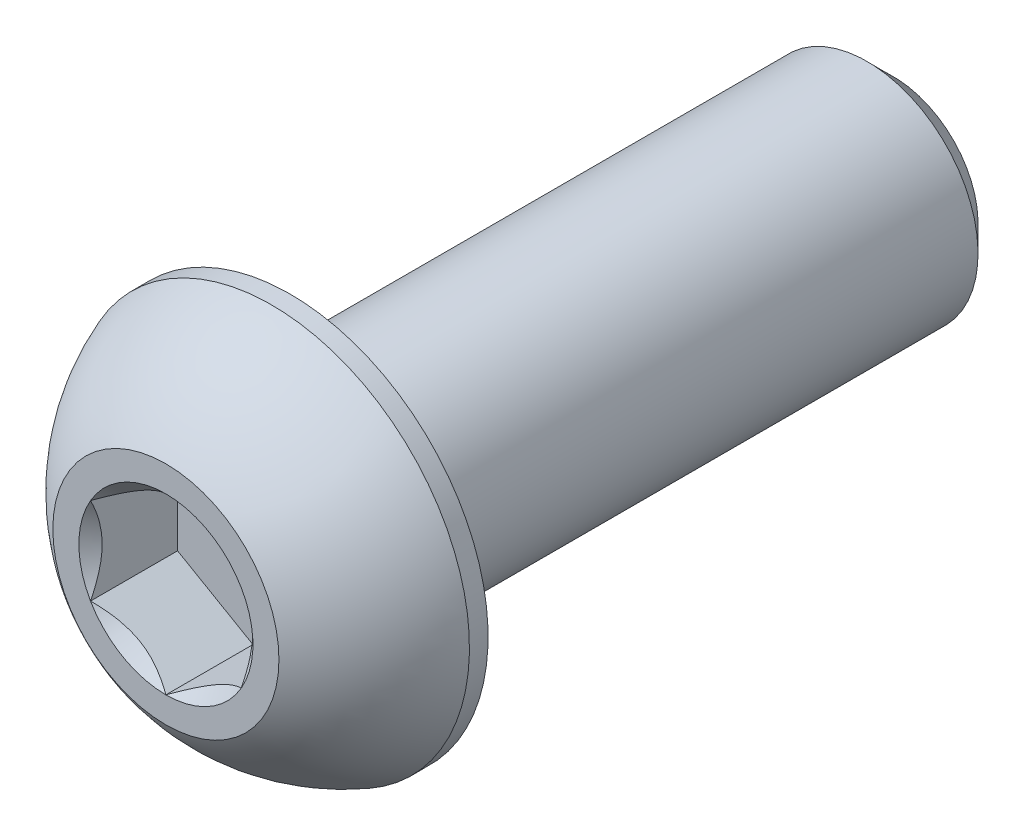
ISO-10303-21;
HEADER;
FILE_DESCRIPTION(('STEP AP214'),'2;1');
FILE_NAME('part.step','',(''),(''),'','','');
FILE_SCHEMA(('AUTOMOTIVE_DESIGN { 1 0 10303 214 1 1 1 1 }'));
ENDSEC;
DATA;
#1=APPLICATION_CONTEXT('core data for automotive mechanical design processes');
#2=APPLICATION_PROTOCOL_DEFINITION('international standard','automotive_design',2000,#1);
#3=PRODUCT_CONTEXT('',#1,'mechanical');
#4=PRODUCT('Part','Part','',(#3));
#5=PRODUCT_RELATED_PRODUCT_CATEGORY('part','',(#4));
#6=PRODUCT_DEFINITION_FORMATION('','',#4);
#7=PRODUCT_DEFINITION_CONTEXT('part definition',#1,'design');
#8=PRODUCT_DEFINITION('design','',#6,#7);
#9=PRODUCT_DEFINITION_SHAPE('','',#8);
#10=(LENGTH_UNIT() NAMED_UNIT(*) SI_UNIT(.MILLI.,.METRE.));
#11=(NAMED_UNIT(*) PLANE_ANGLE_UNIT() SI_UNIT($,.RADIAN.));
#12=(NAMED_UNIT(*) SI_UNIT($,.STERADIAN.) SOLID_ANGLE_UNIT());
#13=UNCERTAINTY_MEASURE_WITH_UNIT(LENGTH_MEASURE(1.E-05),#10,'distance_accuracy_value','');
#14=(GEOMETRIC_REPRESENTATION_CONTEXT(3) GLOBAL_UNCERTAINTY_ASSIGNED_CONTEXT((#13)) GLOBAL_UNIT_ASSIGNED_CONTEXT((#10,
#11,#12)) REPRESENTATION_CONTEXT('',''));
#15=CARTESIAN_POINT('',(0.,0.,0.));
#16=DIRECTION('',(0.,0.,1.));
#17=DIRECTION('',(1.,0.,0.));
#18=AXIS2_PLACEMENT_3D('',#15,#16,#17);
#19=CARTESIAN_POINT('',(0.,-2.3094010767585,0.99));
#20=DIRECTION('',(0.5,-0.866025403784439,0.));
#21=DIRECTION('',(0.,0.,-1.));
#22=AXIS2_PLACEMENT_3D('',#19,#20,#21);
#23=PLANE('',#22);
#24=DIRECTION('',(0.,0.,1.));
#25=VECTOR('',#24,1.);
#26=CARTESIAN_POINT('',(0.,-2.3094010767585,0.99));
#27=LINE('',#26,#25);
#28=CARTESIAN_POINT('',(0.,-2.3094010767585,0.99));
#29=VERTEX_POINT('',#28);
#30=CARTESIAN_POINT('',(0.,-2.3094010767585,3.3));
#31=VERTEX_POINT('',#30);
#32=EDGE_CURVE('E11',#29,#31,#27,.T.);
#33=ORIENTED_EDGE('',*,*,#32,.T.);
#34=CARTESIAN_POINT('',(-5.24396545160089E-12,-2.30940107676153,3.30000000000303));
#35=CARTESIAN_POINT('',(1.,-1.73205080756888,2.72264973080811));
#36=CARTESIAN_POINT('',(2.00000000000524,-1.15470053837622,3.30000000000303));
#37=(BOUNDED_CURVE() B_SPLINE_CURVE(2,(#34,#35,#36),.UNSPECIFIED.,.F.,
.F.) B_SPLINE_CURVE_WITH_KNOTS((3,3),(-0.45323387245921,-0.135550185295981),
.UNSPECIFIED.) CURVE() GEOMETRIC_REPRESENTATION_ITEM() RATIONAL_B_SPLINE_CURVE((1.23205080756801,
1.42264973081124,1.23205080756801)) REPRESENTATION_ITEM(''));
#38=CARTESIAN_POINT('',(2.,-1.15470053837925,3.3));
#39=VERTEX_POINT('',#38);
#40=EDGE_CURVE('E152',#31,#39,#37,.T.);
#41=ORIENTED_EDGE('',*,*,#40,.T.);
#42=DIRECTION('',(0.,0.,1.));
#43=VECTOR('',#42,1.);
#44=CARTESIAN_POINT('',(2.,-1.15470053837925,0.99));
#45=LINE('',#44,#43);
#46=CARTESIAN_POINT('',(2.,-1.15470053837925,0.99));
#47=VERTEX_POINT('',#46);
#48=EDGE_CURVE('E96',#47,#39,#45,.T.);
#49=ORIENTED_EDGE('',*,*,#48,.F.);
#50=DIRECTION('',(0.866025403784439,0.5,0.));
#51=VECTOR('',#50,1.);
#52=CARTESIAN_POINT('',(0.,-2.3094010767585,0.99));
#53=LINE('',#52,#51);
#54=EDGE_CURVE('E147',#29,#47,#53,.T.);
#55=ORIENTED_EDGE('',*,*,#54,.F.);
#56=EDGE_LOOP('',(#33,#41,#49,#55));
#57=FACE_BOUND('',#56,.T.);
#58=ADVANCED_FACE('F17',(#57),#23,.F.);
#59=CARTESIAN_POINT('',(-2.,-1.15470053837925,0.99));
#60=DIRECTION('',(-0.5,-0.866025403784439,0.));
#61=DIRECTION('',(-0.866025403784439,0.5,0.));
#62=AXIS2_PLACEMENT_3D('',#59,#60,#61);
#63=PLANE('',#62);
#64=DIRECTION('',(0.,0.,1.));
#65=VECTOR('',#64,1.);
#66=CARTESIAN_POINT('',(-2.,-1.15470053837925,0.99));
#67=LINE('',#66,#65);
#68=CARTESIAN_POINT('',(-2.,-1.15470053837925,0.99));
#69=VERTEX_POINT('',#68);
#70=CARTESIAN_POINT('',(-2.,-1.15470053837925,3.3));
#71=VERTEX_POINT('',#70);
#72=EDGE_CURVE('E28',#69,#71,#67,.T.);
#73=ORIENTED_EDGE('',*,*,#72,.T.);
#74=CARTESIAN_POINT('',(-2.00000000000525,-1.15470053837622,3.30000000000303));
#75=CARTESIAN_POINT('',(-1.,-1.73205080756888,2.72264973080811));
#76=CARTESIAN_POINT('',(5.24477645770228E-12,-2.30940107676153,3.30000000000303));
#77=(BOUNDED_CURVE() B_SPLINE_CURVE(2,(#74,#75,#76),.UNSPECIFIED.,.F.,
.F.) B_SPLINE_CURVE_WITH_KNOTS((3,3),(-0.45323387245921,-0.135550185295981),
.UNSPECIFIED.) CURVE() GEOMETRIC_REPRESENTATION_ITEM() RATIONAL_B_SPLINE_CURVE((1.23205080756801,
1.42264973081124,1.23205080756801)) REPRESENTATION_ITEM(''));
#78=EDGE_CURVE('E153',#71,#31,#77,.T.);
#79=ORIENTED_EDGE('',*,*,#78,.T.);
#80=ORIENTED_EDGE('',*,*,#32,.F.);
#81=DIRECTION('',(0.866025403784439,-0.5,0.));
#82=VECTOR('',#81,1.);
#83=CARTESIAN_POINT('',(-2.,-1.15470053837925,0.99));
#84=LINE('',#83,#82);
#85=EDGE_CURVE('E201',#69,#29,#84,.T.);
#86=ORIENTED_EDGE('',*,*,#85,.F.);
#87=EDGE_LOOP('',(#73,#79,#80,#86));
#88=FACE_BOUND('',#87,.T.);
#89=ADVANCED_FACE('F287',(#88),#63,.F.);
#90=CARTESIAN_POINT('',(-2.,1.15470053837925,0.99));
#91=DIRECTION('',(-1.,0.,0.));
#92=DIRECTION('',(0.,1.,0.));
#93=AXIS2_PLACEMENT_3D('',#90,#91,#92);
#94=PLANE('',#93);
#95=DIRECTION('',(0.,0.,1.));
#96=VECTOR('',#95,1.);
#97=CARTESIAN_POINT('',(-2.,1.15470053837925,0.99));
#98=LINE('',#97,#96);
#99=CARTESIAN_POINT('',(-2.,1.15470053837925,0.99));
#100=VERTEX_POINT('',#99);
#101=CARTESIAN_POINT('',(-2.,1.15470053837925,3.3));
#102=VERTEX_POINT('',#101);
#103=EDGE_CURVE('E165',#100,#102,#98,.T.);
#104=ORIENTED_EDGE('',*,*,#103,.T.);
#105=CARTESIAN_POINT('',(-2.,1.15470053838531,3.30000000000303));
#106=CARTESIAN_POINT('',(-2.,0.,2.72264973080811));
#107=CARTESIAN_POINT('',(-2.,-1.15470053838531,3.30000000000303));
#108=(BOUNDED_CURVE() B_SPLINE_CURVE(2,(#105,#106,#107),.UNSPECIFIED.,.F.,
.F.) B_SPLINE_CURVE_WITH_KNOTS((3,3),(-0.45323387245921,-0.135550185295981),
.UNSPECIFIED.) CURVE() GEOMETRIC_REPRESENTATION_ITEM() RATIONAL_B_SPLINE_CURVE((1.23205080756801,
1.42264973081124,1.23205080756801)) REPRESENTATION_ITEM(''));
#109=EDGE_CURVE('E158',#102,#71,#108,.T.);
#110=ORIENTED_EDGE('',*,*,#109,.T.);
#111=ORIENTED_EDGE('',*,*,#72,.F.);
#112=DIRECTION('',(0.,-1.,0.));
#113=VECTOR('',#112,1.);
#114=CARTESIAN_POINT('',(-2.,1.15470053837925,0.99));
#115=LINE('',#114,#113);
#116=EDGE_CURVE('E194',#100,#69,#115,.T.);
#117=ORIENTED_EDGE('',*,*,#116,.F.);
#118=EDGE_LOOP('',(#104,#110,#111,#117));
#119=FACE_BOUND('',#118,.T.);
#120=ADVANCED_FACE('F293',(#119),#94,.F.);
#121=CARTESIAN_POINT('',(0.,2.3094010767585,0.99));
#122=DIRECTION('',(-0.5,0.866025403784439,0.));
#123=DIRECTION('',(0.,0.,1.));
#124=AXIS2_PLACEMENT_3D('',#121,#122,#123);
#125=PLANE('',#124);
#126=DIRECTION('',(0.,0.,1.));
#127=VECTOR('',#126,1.);
#128=CARTESIAN_POINT('',(0.,2.3094010767585,0.99));
#129=LINE('',#128,#127);
#130=CARTESIAN_POINT('',(0.,2.3094010767585,0.99));
#131=VERTEX_POINT('',#130);
#132=CARTESIAN_POINT('',(0.,2.3094010767585,3.3));
#133=VERTEX_POINT('',#132);
#134=EDGE_CURVE('E185',#131,#133,#129,.T.);
#135=ORIENTED_EDGE('',*,*,#134,.T.);
#136=CARTESIAN_POINT('',(5.24261377476524E-12,2.30940107676153,3.30000000000303));
#137=CARTESIAN_POINT('',(-1.,1.73205080756888,2.72264973080811));
#138=CARTESIAN_POINT('',(-2.00000000000525,1.15470053837622,3.30000000000303));
#139=(BOUNDED_CURVE() B_SPLINE_CURVE(2,(#136,#137,#138),.UNSPECIFIED.,.F.,
.F.) B_SPLINE_CURVE_WITH_KNOTS((3,3),(-0.45323387245921,-0.135550185295981),
.UNSPECIFIED.) CURVE() GEOMETRIC_REPRESENTATION_ITEM() RATIONAL_B_SPLINE_CURVE((1.23205080756801,
1.42264973081124,1.23205080756801)) REPRESENTATION_ITEM(''));
#140=EDGE_CURVE('E183',#133,#102,#139,.T.);
#141=ORIENTED_EDGE('',*,*,#140,.T.);
#142=ORIENTED_EDGE('',*,*,#103,.F.);
#143=DIRECTION('',(-0.866025403784439,-0.5,0.));
#144=VECTOR('',#143,1.);
#145=CARTESIAN_POINT('',(0.,2.3094010767585,0.99));
#146=LINE('',#145,#144);
#147=EDGE_CURVE('E191',#131,#100,#146,.T.);
#148=ORIENTED_EDGE('',*,*,#147,.F.);
#149=EDGE_LOOP('',(#135,#141,#142,#148));
#150=FACE_BOUND('',#149,.T.);
#151=ADVANCED_FACE('F283',(#150),#125,.F.);
#152=CARTESIAN_POINT('',(2.,1.15470053837925,0.99));
#153=DIRECTION('',(0.5,0.866025403784439,0.));
#154=DIRECTION('',(0.,0.,-1.));
#155=AXIS2_PLACEMENT_3D('',#152,#153,#154);
#156=PLANE('',#155);
#157=DIRECTION('',(0.,0.,1.));
#158=VECTOR('',#157,1.);
#159=CARTESIAN_POINT('',(2.,1.15470053837925,0.99));
#160=LINE('',#159,#158);
#161=CARTESIAN_POINT('',(2.,1.15470053837925,0.99));
#162=VERTEX_POINT('',#161);
#163=CARTESIAN_POINT('',(2.,1.15470053837925,3.3));
#164=VERTEX_POINT('',#163);
#165=EDGE_CURVE('E106',#162,#164,#160,.T.);
#166=ORIENTED_EDGE('',*,*,#165,.T.);
#167=CARTESIAN_POINT('',(2.00000000000525,1.15470053837622,3.30000000000303));
#168=CARTESIAN_POINT('',(1.,1.73205080756888,2.7226497308081));
#169=CARTESIAN_POINT('',(-5.24630835811603E-12,2.30940107676153,3.30000000000303));
#170=(BOUNDED_CURVE() B_SPLINE_CURVE(2,(#167,#168,#169),.UNSPECIFIED.,.F.,
.F.) B_SPLINE_CURVE_WITH_KNOTS((3,3),(-0.45323387245921,-0.135550185295981),
.UNSPECIFIED.) CURVE() GEOMETRIC_REPRESENTATION_ITEM() RATIONAL_B_SPLINE_CURVE((1.23205080756801,
1.42264973081124,1.23205080756801)) REPRESENTATION_ITEM(''));
#171=EDGE_CURVE('E177',#164,#133,#170,.T.);
#172=ORIENTED_EDGE('',*,*,#171,.T.);
#173=ORIENTED_EDGE('',*,*,#134,.F.);
#174=DIRECTION('',(-0.866025403784439,0.5,0.));
#175=VECTOR('',#174,1.);
#176=CARTESIAN_POINT('',(2.,1.15470053837925,0.99));
#177=LINE('',#176,#175);
#178=EDGE_CURVE('E146',#162,#131,#177,.T.);
#179=ORIENTED_EDGE('',*,*,#178,.F.);
#180=EDGE_LOOP('',(#166,#172,#173,#179));
#181=FACE_BOUND('',#180,.T.);
#182=ADVANCED_FACE('F273',(#181),#156,.F.);
#183=CARTESIAN_POINT('',(2.,-1.15470053837925,0.99));
#184=DIRECTION('',(1.,0.,0.));
#185=DIRECTION('',(0.,1.,0.));
#186=AXIS2_PLACEMENT_3D('',#183,#184,#185);
#187=PLANE('',#186);
#188=ORIENTED_EDGE('',*,*,#48,.T.);
#189=CARTESIAN_POINT('',(2.,-1.15470053838531,3.30000000000303));
#190=CARTESIAN_POINT('',(2.,0.,2.7226497308081));
#191=CARTESIAN_POINT('',(2.,1.15470053838531,3.30000000000303));
#192=(BOUNDED_CURVE() B_SPLINE_CURVE(2,(#189,#190,#191),.UNSPECIFIED.,.F.,
.F.) B_SPLINE_CURVE_WITH_KNOTS((3,3),(-0.453233872459803,-0.135550185296338),
.UNSPECIFIED.) CURVE() GEOMETRIC_REPRESENTATION_ITEM() RATIONAL_B_SPLINE_CURVE((1.23205080756872,
1.42264973081205,1.23205080756872)) REPRESENTATION_ITEM(''));
#193=EDGE_CURVE('E126',#39,#164,#192,.T.);
#194=ORIENTED_EDGE('',*,*,#193,.T.);
#195=ORIENTED_EDGE('',*,*,#165,.F.);
#196=DIRECTION('',(0.,1.,0.));
#197=VECTOR('',#196,1.);
#198=CARTESIAN_POINT('',(2.,-1.15470053837925,0.99));
#199=LINE('',#198,#197);
#200=EDGE_CURVE('E151',#47,#162,#199,.T.);
#201=ORIENTED_EDGE('',*,*,#200,.F.);
#202=EDGE_LOOP('',(#188,#194,#195,#201));
#203=FACE_BOUND('',#202,.T.);
#204=ADVANCED_FACE('F270',(#203),#187,.F.);
#205=CARTESIAN_POINT('',(2.,-1.15470053837925,0.99));
#206=DIRECTION('',(0.,0.,1.));
#207=DIRECTION('',(1.,0.,0.));
#208=AXIS2_PLACEMENT_3D('',#205,#206,#207);
#209=PLANE('',#208);
#210=ORIENTED_EDGE('',*,*,#54,.T.);
#211=ORIENTED_EDGE('',*,*,#200,.T.);
#212=ORIENTED_EDGE('',*,*,#178,.T.);
#213=ORIENTED_EDGE('',*,*,#147,.T.);
#214=ORIENTED_EDGE('',*,*,#116,.T.);
#215=ORIENTED_EDGE('',*,*,#85,.T.);
#216=EDGE_LOOP('',(#210,#211,#212,#213,#214,#215));
#217=FACE_BOUND('',#216,.T.);
#218=ADVANCED_FACE('F272',(#217),#209,.T.);
#219=CARTESIAN_POINT('',(0.,0.,3.3));
#220=DIRECTION('',(0.,0.,1.));
#221=DIRECTION('',(1.,0.,0.));
#222=AXIS2_PLACEMENT_3D('',#219,#220,#221);
#223=CONICAL_SURFACE('',#222,2.3094010767585,0.78539816339745);
#224=CARTESIAN_POINT('',(0.,0.,3.3));
#225=DIRECTION('',(0.,0.,1.));
#226=DIRECTION('',(1.,0.,0.));
#227=AXIS2_PLACEMENT_3D('',#224,#225,#226);
#228=CIRCLE('',#227,2.3094010767585);
#229=EDGE_CURVE('E217',#31,#39,#228,.T.);
#230=ORIENTED_EDGE('',*,*,#229,.T.);
#231=ORIENTED_EDGE('',*,*,#40,.F.);
#232=EDGE_LOOP('',(#230,#231));
#233=FACE_BOUND('',#232,.T.);
#234=ADVANCED_FACE('F256',(#233),#223,.F.);
#235=CARTESIAN_POINT('',(0.,0.,3.3));
#236=DIRECTION('',(0.,0.,1.));
#237=DIRECTION('',(1.,0.,0.));
#238=AXIS2_PLACEMENT_3D('',#235,#236,#237);
#239=CONICAL_SURFACE('',#238,2.3094010767585,0.78539816339745);
#240=CARTESIAN_POINT('',(0.,0.,3.3));
#241=DIRECTION('',(0.,0.,1.));
#242=DIRECTION('',(1.,0.,0.));
#243=AXIS2_PLACEMENT_3D('',#240,#241,#242);
#244=CIRCLE('',#243,2.3094010767585);
#245=EDGE_CURVE('E184',#71,#31,#244,.T.);
#246=ORIENTED_EDGE('',*,*,#245,.T.);
#247=ORIENTED_EDGE('',*,*,#78,.F.);
#248=EDGE_LOOP('',(#246,#247));
#249=FACE_BOUND('',#248,.T.);
#250=ADVANCED_FACE('F19',(#249),#239,.F.);
#251=CARTESIAN_POINT('',(0.,0.,3.3));
#252=DIRECTION('',(0.,0.,1.));
#253=DIRECTION('',(-1.,0.,0.));
#254=AXIS2_PLACEMENT_3D('',#251,#252,#253);
#255=CONICAL_SURFACE('',#254,2.3094010767585,0.78539816339745);
#256=CARTESIAN_POINT('',(0.,0.,3.3));
#257=DIRECTION('',(0.,0.,1.));
#258=DIRECTION('',(1.,0.,0.));
#259=AXIS2_PLACEMENT_3D('',#256,#257,#258);
#260=CIRCLE('',#259,2.3094010767585);
#261=EDGE_CURVE('E176',#102,#71,#260,.T.);
#262=ORIENTED_EDGE('',*,*,#261,.T.);
#263=ORIENTED_EDGE('',*,*,#109,.F.);
#264=EDGE_LOOP('',(#262,#263));
#265=FACE_BOUND('',#264,.T.);
#266=ADVANCED_FACE('F298',(#265),#255,.F.);
#267=CARTESIAN_POINT('',(0.,0.,3.3));
#268=DIRECTION('',(0.,0.,1.));
#269=DIRECTION('',(1.,0.,0.));
#270=AXIS2_PLACEMENT_3D('',#267,#268,#269);
#271=CONICAL_SURFACE('',#270,2.3094010767585,0.78539816339745);
#272=CARTESIAN_POINT('',(0.,0.,3.3));
#273=DIRECTION('',(0.,0.,1.));
#274=DIRECTION('',(1.,0.,0.));
#275=AXIS2_PLACEMENT_3D('',#272,#273,#274);
#276=CIRCLE('',#275,2.3094010767585);
#277=EDGE_CURVE('E171',#133,#102,#276,.T.);
#278=ORIENTED_EDGE('',*,*,#277,.T.);
#279=ORIENTED_EDGE('',*,*,#140,.F.);
#280=EDGE_LOOP('',(#278,#279));
#281=FACE_BOUND('',#280,.T.);
#282=ADVANCED_FACE('F301',(#281),#271,.F.);
#283=CARTESIAN_POINT('',(0.,0.,3.3));
#284=DIRECTION('',(0.,0.,1.));
#285=DIRECTION('',(1.,0.,0.));
#286=AXIS2_PLACEMENT_3D('',#283,#284,#285);
#287=CONICAL_SURFACE('',#286,2.3094010767585,0.78539816339745);
#288=CARTESIAN_POINT('',(0.,0.,3.3));
#289=DIRECTION('',(0.,0.,1.));
#290=DIRECTION('',(1.,0.,0.));
#291=AXIS2_PLACEMENT_3D('',#288,#289,#290);
#292=CIRCLE('',#291,2.3094010767585);
#293=EDGE_CURVE('E175',#164,#133,#292,.T.);
#294=ORIENTED_EDGE('',*,*,#293,.T.);
#295=ORIENTED_EDGE('',*,*,#171,.F.);
#296=EDGE_LOOP('',(#294,#295));
#297=FACE_BOUND('',#296,.T.);
#298=ADVANCED_FACE('F308',(#297),#287,.F.);
#299=CARTESIAN_POINT('',(0.,-3.,3.3));
#300=DIRECTION('',(0.,0.,-1.));
#301=DIRECTION('',(0.,-1.,0.));
#302=AXIS2_PLACEMENT_3D('',#299,#300,#301);
#303=PLANE('',#302);
#304=ORIENTED_EDGE('',*,*,#261,.F.);
#305=ORIENTED_EDGE('',*,*,#277,.F.);
#306=ORIENTED_EDGE('',*,*,#293,.F.);
#307=CARTESIAN_POINT('',(0.,0.,3.3));
#308=DIRECTION('',(0.,0.,1.));
#309=DIRECTION('',(1.,0.,0.));
#310=AXIS2_PLACEMENT_3D('',#307,#308,#309);
#311=CIRCLE('',#310,2.3094010767585);
#312=EDGE_CURVE('E170',#39,#164,#311,.T.);
#313=ORIENTED_EDGE('',*,*,#312,.F.);
#314=ORIENTED_EDGE('',*,*,#229,.F.);
#315=ORIENTED_EDGE('',*,*,#245,.F.);
#316=EDGE_LOOP('',(#304,#305,#306,#313,#314,#315));
#317=FACE_BOUND('',#316,.T.);
#318=CARTESIAN_POINT('',(0.,0.,3.3));
#319=DIRECTION('',(0.,0.,1.));
#320=DIRECTION('',(1.,0.,0.));
#321=AXIS2_PLACEMENT_3D('',#318,#319,#320);
#322=CIRCLE('',#321,3.);
#323=CARTESIAN_POINT('',(0.,-3.,3.3));
#324=VERTEX_POINT('',#323);
#325=EDGE_CURVE('E504',#324,#324,#322,.T.);
#326=ORIENTED_EDGE('',*,*,#325,.T.);
#327=EDGE_LOOP('',(#326));
#328=FACE_BOUND('',#327,.T.);
#329=ADVANCED_FACE('F264',(#317,#328),#303,.F.);
#330=CARTESIAN_POINT('',(0.,-3.,-16.));
#331=DIRECTION('',(0.,0.,-1.));
#332=DIRECTION('',(0.,-1.,0.));
#333=AXIS2_PLACEMENT_3D('',#330,#331,#332);
#334=PLANE('',#333);
#335=CARTESIAN_POINT('',(0.,0.,-16.));
#336=DIRECTION('',(0.,0.,-1.));
#337=DIRECTION('',(0.,1.,0.));
#338=AXIS2_PLACEMENT_3D('',#335,#336,#337);
#339=CIRCLE('',#338,2.25);
#340=CARTESIAN_POINT('',(0.,-2.25,-16.));
#341=VERTEX_POINT('',#340);
#342=EDGE_CURVE('E133',#341,#341,#339,.T.);
#343=ORIENTED_EDGE('',*,*,#342,.T.);
#344=EDGE_LOOP('',(#343));
#345=FACE_BOUND('',#344,.T.);
#346=ADVANCED_FACE('F313',(#345),#334,.T.);
#347=CARTESIAN_POINT('',(0.,0.,-1.41132352941176));
#348=DIRECTION('',(1.,0.,0.));
#349=DIRECTION('',(0.,-1.,0.));
#350=AXIS2_PLACEMENT_3D('',#347,#348,#349);
#351=SPHERICAL_SURFACE('',#350,5.58538892099637);
#352=CARTESIAN_POINT('',(0.,0.,-1.41132352941176));
#353=DIRECTION('',(0.,0.,1.));
#354=DIRECTION('',(1.,0.,0.));
#355=AXIS2_PLACEMENT_3D('',#352,#353,#354);
#356=SPHERICAL_SURFACE('',#355,5.58538892099637);
#357=ORIENTED_EDGE('',*,*,#325,.F.);
#358=EDGE_LOOP('',(#357));
#359=FACE_BOUND('',#358,.T.);
#360=CARTESIAN_POINT('',(0.,0.,0.495));
#361=DIRECTION('',(0.,0.,1.));
#362=DIRECTION('',(1.,0.,0.));
#363=AXIS2_PLACEMENT_3D('',#360,#361,#362);
#364=CIRCLE('',#363,5.25);
#365=CARTESIAN_POINT('',(-5.25,0.,0.495));
#366=VERTEX_POINT('',#365);
#367=EDGE_CURVE('E166',#366,#366,#364,.T.);
#368=ORIENTED_EDGE('',*,*,#367,.T.);
#369=EDGE_LOOP('',(#368));
#370=FACE_BOUND('',#369,.T.);
#371=ADVANCED_FACE('F318',(#359,#370),#356,.T.);
#372=CARTESIAN_POINT('',(0.,0.,3.3));
#373=DIRECTION('',(0.,0.,1.));
#374=DIRECTION('',(1.,0.,0.));
#375=AXIS2_PLACEMENT_3D('',#372,#373,#374);
#376=CYLINDRICAL_SURFACE('',#375,5.25);
#377=ORIENTED_EDGE('',*,*,#367,.F.);
#378=DIRECTION('',(0.,0.,-1.));
#379=VECTOR('',#378,1.);
#380=CARTESIAN_POINT('',(-5.25,0.,3.3));
#381=LINE('',#380,#379);
#382=CARTESIAN_POINT('',(-5.25,0.,0.));
#383=VERTEX_POINT('',#382);
#384=EDGE_CURVE('E21',#366,#383,#381,.T.);
#385=ORIENTED_EDGE('',*,*,#384,.T.);
#386=CARTESIAN_POINT('',(0.,0.,0.));
#387=DIRECTION('',(0.,0.,1.));
#388=DIRECTION('',(1.,0.,0.));
#389=AXIS2_PLACEMENT_3D('',#386,#387,#388);
#390=CIRCLE('',#389,5.25);
#391=EDGE_CURVE('E141',#383,#383,#390,.T.);
#392=ORIENTED_EDGE('',*,*,#391,.T.);
#393=ORIENTED_EDGE('',*,*,#384,.F.);
#394=EDGE_LOOP('',(#377,#385,#392,#393));
#395=FACE_BOUND('',#394,.T.);
#396=ADVANCED_FACE('F305',(#395),#376,.T.);
#397=CARTESIAN_POINT('',(0.,0.,3.3));
#398=DIRECTION('',(0.,0.,1.));
#399=DIRECTION('',(1.,0.,0.));
#400=AXIS2_PLACEMENT_3D('',#397,#398,#399);
#401=CONICAL_SURFACE('',#400,2.3094010767585,0.78539816339745);
#402=ORIENTED_EDGE('',*,*,#193,.F.);
#403=ORIENTED_EDGE('',*,*,#312,.T.);
#404=EDGE_LOOP('',(#402,#403));
#405=FACE_BOUND('',#404,.T.);
#406=ADVANCED_FACE('F269',(#405),#401,.F.);
#407=CARTESIAN_POINT('',(0.,0.,-16.));
#408=DIRECTION('',(0.,0.,-1.));
#409=DIRECTION('',(0.,1.,0.));
#410=AXIS2_PLACEMENT_3D('',#407,#408,#409);
#411=CYLINDRICAL_SURFACE('',#410,2.942);
#412=CARTESIAN_POINT('',(0.,0.,-15.308));
#413=DIRECTION('',(0.,0.,1.));
#414=DIRECTION('',(0.,1.,0.));
#415=AXIS2_PLACEMENT_3D('',#412,#413,#414);
#416=CIRCLE('',#415,2.942);
#417=CARTESIAN_POINT('',(0.,-2.942,-15.308));
#418=VERTEX_POINT('',#417);
#419=EDGE_CURVE('E122',#418,#418,#416,.T.);
#420=ORIENTED_EDGE('',*,*,#419,.T.);
#421=DIRECTION('',(0.,0.,1.));
#422=VECTOR('',#421,1.);
#423=CARTESIAN_POINT('',(0.,-2.942,-16.));
#424=LINE('',#423,#422);
#425=CARTESIAN_POINT('',(0.,-2.942,0.));
#426=VERTEX_POINT('',#425);
#427=EDGE_CURVE('E118',#418,#426,#424,.T.);
#428=ORIENTED_EDGE('',*,*,#427,.T.);
#429=CARTESIAN_POINT('',(0.,0.,0.));
#430=DIRECTION('',(0.,0.,-1.));
#431=DIRECTION('',(0.,1.,0.));
#432=AXIS2_PLACEMENT_3D('',#429,#430,#431);
#433=CIRCLE('',#432,2.942);
#434=EDGE_CURVE('E124',#426,#426,#433,.T.);
#435=ORIENTED_EDGE('',*,*,#434,.T.);
#436=ORIENTED_EDGE('',*,*,#427,.F.);
#437=EDGE_LOOP('',(#420,#428,#435,#436));
#438=FACE_BOUND('',#437,.T.);
#439=ADVANCED_FACE('F120',(#438),#411,.T.);
#440=CARTESIAN_POINT('',(0.,-5.25,0.));
#441=DIRECTION('',(0.,0.,1.));
#442=DIRECTION('',(1.,0.,0.));
#443=AXIS2_PLACEMENT_3D('',#440,#441,#442);
#444=PLANE('',#443);
#445=ORIENTED_EDGE('',*,*,#434,.F.);
#446=EDGE_LOOP('',(#445));
#447=FACE_BOUND('',#446,.T.);
#448=ORIENTED_EDGE('',*,*,#391,.F.);
#449=EDGE_LOOP('',(#448));
#450=FACE_BOUND('',#449,.T.);
#451=ADVANCED_FACE('F332',(#447,#450),#444,.F.);
#452=CARTESIAN_POINT('',(0.,0.,-15.625));
#453=DIRECTION('',(0.,0.,1.));
#454=DIRECTION('',(0.,1.,0.));
#455=AXIS2_PLACEMENT_3D('',#452,#453,#454);
#456=CONICAL_SURFACE('',#455,2.625,0.785398163397448);
#457=ORIENTED_EDGE('',*,*,#419,.F.);
#458=DIRECTION('',(0.,0.707106781186548,-0.707106781186547));
#459=VECTOR('',#458,1.);
#460=CARTESIAN_POINT('',(0.,-2.625,-15.625));
#461=LINE('',#460,#459);
#462=EDGE_CURVE('E131',#418,#341,#461,.T.);
#463=ORIENTED_EDGE('',*,*,#462,.T.);
#464=ORIENTED_EDGE('',*,*,#342,.F.);
#465=ORIENTED_EDGE('',*,*,#462,.F.);
#466=EDGE_LOOP('',(#457,#463,#464,#465));
#467=FACE_BOUND('',#466,.T.);
#468=ADVANCED_FACE('F132',(#467),#456,.T.);
#469=CLOSED_SHELL('',(#58,#89,#120,#151,#182,#204,#218,#234,#250,#266,#282,#298,#329,#346,#371,
#396,#406,#439,#451,#468));
#470=MANIFOLD_SOLID_BREP('B1',#469);
#471=ADVANCED_BREP_SHAPE_REPRESENTATION('',(#18,#470),#14);
#472=SHAPE_DEFINITION_REPRESENTATION(#9,#471);
ENDSEC;
END-ISO-10303-21;
